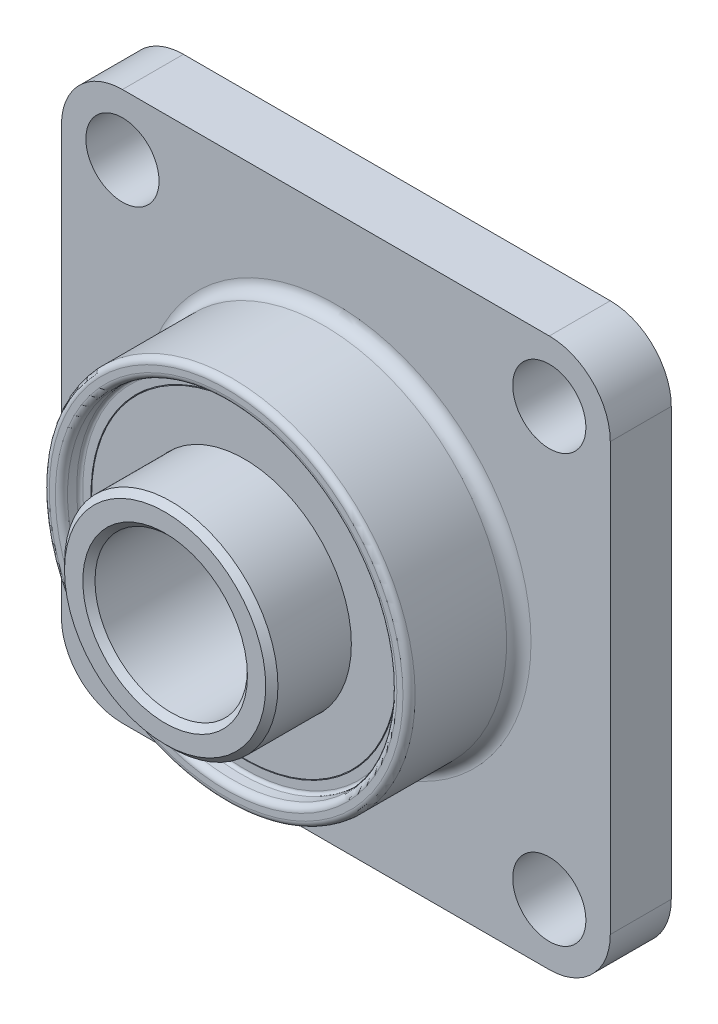
ISO-10303-21;
HEADER;
FILE_DESCRIPTION(('STEP AP214'),'2;1');
FILE_NAME('part.step','',(''),(''),'','','');
FILE_SCHEMA(('AUTOMOTIVE_DESIGN { 1 0 10303 214 1 1 1 1 }'));
ENDSEC;
DATA;
#1=APPLICATION_CONTEXT('core data for automotive mechanical design processes');
#2=APPLICATION_PROTOCOL_DEFINITION('international standard','automotive_design',2000,#1);
#3=PRODUCT_CONTEXT('',#1,'mechanical');
#4=PRODUCT('Part','Part','',(#3));
#5=PRODUCT_RELATED_PRODUCT_CATEGORY('part','',(#4));
#6=PRODUCT_DEFINITION_FORMATION('','',#4);
#7=PRODUCT_DEFINITION_CONTEXT('part definition',#1,'design');
#8=PRODUCT_DEFINITION('design','',#6,#7);
#9=PRODUCT_DEFINITION_SHAPE('','',#8);
#10=(LENGTH_UNIT() NAMED_UNIT(*) SI_UNIT(.MILLI.,.METRE.));
#11=(NAMED_UNIT(*) PLANE_ANGLE_UNIT() SI_UNIT($,.RADIAN.));
#12=(NAMED_UNIT(*) SI_UNIT($,.STERADIAN.) SOLID_ANGLE_UNIT());
#13=UNCERTAINTY_MEASURE_WITH_UNIT(LENGTH_MEASURE(1.E-05),#10,'distance_accuracy_value','');
#14=(GEOMETRIC_REPRESENTATION_CONTEXT(3) GLOBAL_UNCERTAINTY_ASSIGNED_CONTEXT((#13)) GLOBAL_UNIT_ASSIGNED_CONTEXT((#10,
#11,#12)) REPRESENTATION_CONTEXT('',''));
#15=CARTESIAN_POINT('',(0.,0.,0.));
#16=DIRECTION('',(0.,0.,1.));
#17=DIRECTION('',(1.,0.,0.));
#18=AXIS2_PLACEMENT_3D('',#15,#16,#17);
#19=CARTESIAN_POINT('',(0.,0.,38.));
#20=DIRECTION('',(0.,0.,1.));
#21=DIRECTION('',(1.,0.,0.));
#22=AXIS2_PLACEMENT_3D('',#19,#20,#21);
#23=PLANE('',#22);
#24=CARTESIAN_POINT('',(0.,0.,38.));
#25=DIRECTION('',(0.,0.,1.));
#26=DIRECTION('',(1.,0.,0.));
#27=AXIS2_PLACEMENT_3D('',#24,#25,#26);
#28=CIRCLE('',#27,13.5);
#29=CARTESIAN_POINT('',(13.5,0.,38.));
#30=VERTEX_POINT('',#29);
#31=EDGE_CURVE('E66',#30,#30,#28,.F.);
#32=ORIENTED_EDGE('',*,*,#31,.T.);
#33=EDGE_LOOP('',(#32));
#34=FACE_BOUND('',#33,.T.);
#35=CARTESIAN_POINT('',(0.,0.,38.));
#36=DIRECTION('',(0.,0.,1.));
#37=DIRECTION('',(1.,0.,0.));
#38=AXIS2_PLACEMENT_3D('',#35,#36,#37);
#39=CIRCLE('',#38,16.5);
#40=CARTESIAN_POINT('',(16.5,0.,38.));
#41=VERTEX_POINT('',#40);
#42=EDGE_CURVE('E69',#41,#41,#39,.T.);
#43=ORIENTED_EDGE('',*,*,#42,.T.);
#44=EDGE_LOOP('',(#43));
#45=FACE_BOUND('',#44,.T.);
#46=ADVANCED_FACE('F43',(#34,#45),#23,.T.);
#47=CARTESIAN_POINT('',(0.,0.,38.));
#48=DIRECTION('',(0.,0.,-1.));
#49=DIRECTION('',(-1.,0.,0.));
#50=AXIS2_PLACEMENT_3D('',#47,#48,#49);
#51=CYLINDRICAL_SURFACE('',#50,17.5);
#52=CARTESIAN_POINT('',(0.,0.,1.00000000000001));
#53=DIRECTION('',(0.,0.,-1.));
#54=DIRECTION('',(-1.,0.,0.));
#55=AXIS2_PLACEMENT_3D('',#52,#53,#54);
#56=CIRCLE('',#55,17.5);
#57=CARTESIAN_POINT('',(-17.5,0.,1.00000000000001));
#58=VERTEX_POINT('',#57);
#59=EDGE_CURVE('E11',#58,#58,#56,.F.);
#60=ORIENTED_EDGE('',*,*,#59,.T.);
#61=EDGE_LOOP('',(#60));
#62=FACE_BOUND('',#61,.T.);
#63=CARTESIAN_POINT('',(0.,0.,37.));
#64=DIRECTION('',(0.,0.,1.));
#65=DIRECTION('',(1.,0.,0.));
#66=AXIS2_PLACEMENT_3D('',#63,#64,#65);
#67=CIRCLE('',#66,17.5);
#68=CARTESIAN_POINT('',(17.5,0.,37.));
#69=VERTEX_POINT('',#68);
#70=EDGE_CURVE('E63',#69,#69,#67,.F.);
#71=ORIENTED_EDGE('',*,*,#70,.T.);
#72=EDGE_LOOP('',(#71));
#73=FACE_BOUND('',#72,.T.);
#74=ADVANCED_FACE('F95',(#62,#73),#51,.T.);
#75=CARTESIAN_POINT('',(0.,0.,38.));
#76=DIRECTION('',(0.,0.,-1.));
#77=DIRECTION('',(-1.,0.,0.));
#78=AXIS2_PLACEMENT_3D('',#75,#76,#77);
#79=CYLINDRICAL_SURFACE('',#78,12.5);
#80=CARTESIAN_POINT('',(0.,0.,1.00000000000001));
#81=DIRECTION('',(0.,0.,-1.));
#82=DIRECTION('',(-1.,0.,0.));
#83=AXIS2_PLACEMENT_3D('',#80,#81,#82);
#84=CIRCLE('',#83,12.5);
#85=CARTESIAN_POINT('',(-12.5,0.,1.00000000000001));
#86=VERTEX_POINT('',#85);
#87=EDGE_CURVE('E58',#86,#86,#84,.T.);
#88=ORIENTED_EDGE('',*,*,#87,.T.);
#89=EDGE_LOOP('',(#88));
#90=FACE_BOUND('',#89,.T.);
#91=CARTESIAN_POINT('',(0.,0.,37.));
#92=DIRECTION('',(0.,0.,1.));
#93=DIRECTION('',(1.,0.,0.));
#94=AXIS2_PLACEMENT_3D('',#91,#92,#93);
#95=CIRCLE('',#94,12.5);
#96=CARTESIAN_POINT('',(12.5,0.,37.));
#97=VERTEX_POINT('',#96);
#98=EDGE_CURVE('E72',#97,#97,#95,.T.);
#99=ORIENTED_EDGE('',*,*,#98,.T.);
#100=EDGE_LOOP('',(#99));
#101=FACE_BOUND('',#100,.T.);
#102=ADVANCED_FACE('F76',(#90,#101),#79,.F.);
#103=CARTESIAN_POINT('',(0.,0.,0.));
#104=DIRECTION('',(0.,0.,-1.));
#105=DIRECTION('',(-1.,0.,0.));
#106=AXIS2_PLACEMENT_3D('',#103,#104,#105);
#107=PLANE('',#106);
#108=CARTESIAN_POINT('',(0.,0.,0.));
#109=DIRECTION('',(0.,0.,-1.));
#110=DIRECTION('',(-1.,0.,0.));
#111=AXIS2_PLACEMENT_3D('',#108,#109,#110);
#112=CIRCLE('',#111,13.5);
#113=CARTESIAN_POINT('',(-13.5,0.,0.));
#114=VERTEX_POINT('',#113);
#115=EDGE_CURVE('E50',#114,#114,#112,.F.);
#116=ORIENTED_EDGE('',*,*,#115,.T.);
#117=EDGE_LOOP('',(#116));
#118=FACE_BOUND('',#117,.T.);
#119=CARTESIAN_POINT('',(0.,0.,0.));
#120=DIRECTION('',(0.,0.,-1.));
#121=DIRECTION('',(-1.,0.,0.));
#122=AXIS2_PLACEMENT_3D('',#119,#120,#121);
#123=CIRCLE('',#122,16.5);
#124=CARTESIAN_POINT('',(-16.5,0.,0.));
#125=VERTEX_POINT('',#124);
#126=EDGE_CURVE('E54',#125,#125,#123,.T.);
#127=ORIENTED_EDGE('',*,*,#126,.T.);
#128=EDGE_LOOP('',(#127));
#129=FACE_BOUND('',#128,.T.);
#130=ADVANCED_FACE('F81',(#118,#129),#107,.T.);
#131=CARTESIAN_POINT('',(0.,0.,37.));
#132=DIRECTION('',(0.,0.,1.));
#133=DIRECTION('',(1.,0.,0.));
#134=AXIS2_PLACEMENT_3D('',#131,#132,#133);
#135=CONICAL_SURFACE('',#134,12.5,0.785398163397453);
#136=ORIENTED_EDGE('',*,*,#31,.F.);
#137=EDGE_LOOP('',(#136));
#138=FACE_BOUND('',#137,.T.);
#139=ORIENTED_EDGE('',*,*,#98,.F.);
#140=EDGE_LOOP('',(#139));
#141=FACE_BOUND('',#140,.T.);
#142=ADVANCED_FACE('F78',(#138,#141),#135,.F.);
#143=CARTESIAN_POINT('',(0.,0.,38.));
#144=DIRECTION('',(0.,0.,-1.));
#145=DIRECTION('',(-1.,0.,0.));
#146=AXIS2_PLACEMENT_3D('',#143,#144,#145);
#147=CONICAL_SURFACE('',#146,16.5,0.785398163397447);
#148=ORIENTED_EDGE('',*,*,#70,.F.);
#149=EDGE_LOOP('',(#148));
#150=FACE_BOUND('',#149,.T.);
#151=ORIENTED_EDGE('',*,*,#42,.F.);
#152=EDGE_LOOP('',(#151));
#153=FACE_BOUND('',#152,.T.);
#154=ADVANCED_FACE('F80',(#150,#153),#147,.T.);
#155=CARTESIAN_POINT('',(0.,0.,1.00000000000001));
#156=DIRECTION('',(0.,0.,-1.));
#157=DIRECTION('',(-1.,0.,0.));
#158=AXIS2_PLACEMENT_3D('',#155,#156,#157);
#159=CONICAL_SURFACE('',#158,12.5,0.785398163397447);
#160=ORIENTED_EDGE('',*,*,#115,.F.);
#161=EDGE_LOOP('',(#160));
#162=FACE_BOUND('',#161,.T.);
#163=ORIENTED_EDGE('',*,*,#87,.F.);
#164=EDGE_LOOP('',(#163));
#165=FACE_BOUND('',#164,.T.);
#166=ADVANCED_FACE('F88',(#162,#165),#159,.F.);
#167=CARTESIAN_POINT('',(0.,0.,0.));
#168=DIRECTION('',(0.,0.,1.));
#169=DIRECTION('',(1.,0.,0.));
#170=AXIS2_PLACEMENT_3D('',#167,#168,#169);
#171=CONICAL_SURFACE('',#170,16.5,0.785398163397443);
#172=ORIENTED_EDGE('',*,*,#59,.F.);
#173=EDGE_LOOP('',(#172));
#174=FACE_BOUND('',#173,.T.);
#175=ORIENTED_EDGE('',*,*,#126,.F.);
#176=EDGE_LOOP('',(#175));
#177=FACE_BOUND('',#176,.T.);
#178=ADVANCED_FACE('F45',(#174,#177),#171,.T.);
#179=CLOSED_SHELL('',(#46,#74,#102,#130,#142,#154,#166,#178));
#180=MANIFOLD_SOLID_BREP('B2',#179);
#181=CARTESIAN_POINT('',(0.,0.,10.));
#182=DIRECTION('',(0.,0.,-1.));
#183=DIRECTION('',(-1.,0.,0.));
#184=AXIS2_PLACEMENT_3D('',#181,#182,#183);
#185=CYLINDRICAL_SURFACE('',#184,24.);
#186=CARTESIAN_POINT('',(0.,0.,10.));
#187=DIRECTION('',(0.,0.,1.));
#188=DIRECTION('',(1.,0.,0.));
#189=AXIS2_PLACEMENT_3D('',#186,#187,#188);
#190=CIRCLE('',#189,24.);
#191=CARTESIAN_POINT('',(24.,0.,10.));
#192=VERTEX_POINT('',#191);
#193=EDGE_CURVE('E581',#192,#192,#190,.T.);
#194=ORIENTED_EDGE('',*,*,#193,.T.);
#195=EDGE_LOOP('',(#194));
#196=FACE_BOUND('',#195,.T.);
#197=CARTESIAN_POINT('',(0.,0.,6.));
#198=DIRECTION('',(0.,0.,-1.));
#199=DIRECTION('',(-1.,0.,0.));
#200=AXIS2_PLACEMENT_3D('',#197,#198,#199);
#201=CIRCLE('',#200,24.);
#202=CARTESIAN_POINT('',(-24.,0.,6.));
#203=VERTEX_POINT('',#202);
#204=EDGE_CURVE('E176',#203,#203,#201,.T.);
#205=ORIENTED_EDGE('',*,*,#204,.T.);
#206=EDGE_LOOP('',(#205));
#207=FACE_BOUND('',#206,.T.);
#208=ADVANCED_FACE('F172',(#196,#207),#185,.F.);
#209=CARTESIAN_POINT('',(35.,35.,10.));
#210=DIRECTION('',(0.,0.,-1.));
#211=DIRECTION('',(-1.,0.,0.));
#212=AXIS2_PLACEMENT_3D('',#209,#210,#211);
#213=PLANE('',#212);
#214=CARTESIAN_POINT('',(0.,0.,10.));
#215=DIRECTION('',(0.,0.,1.));
#216=DIRECTION('',(1.,0.,0.));
#217=AXIS2_PLACEMENT_3D('',#214,#215,#216);
#218=CIRCLE('',#217,25.1543231034533);
#219=CARTESIAN_POINT('',(25.1543231034533,0.,10.));
#220=VERTEX_POINT('',#219);
#221=EDGE_CURVE('E583',#220,#220,#218,.T.);
#222=ORIENTED_EDGE('',*,*,#221,.T.);
#223=EDGE_LOOP('',(#222));
#224=FACE_BOUND('',#223,.T.);
#225=CARTESIAN_POINT('',(0.,0.,10.));
#226=DIRECTION('',(0.,0.,-1.));
#227=DIRECTION('',(-1.,0.,0.));
#228=AXIS2_PLACEMENT_3D('',#225,#226,#227);
#229=CIRCLE('',#228,25.0418054434066);
#230=CARTESIAN_POINT('',(-25.0418054434066,0.,10.));
#231=VERTEX_POINT('',#230);
#232=EDGE_CURVE('E333',#231,#231,#229,.F.);
#233=ORIENTED_EDGE('',*,*,#232,.F.);
#234=EDGE_LOOP('',(#233));
#235=FACE_BOUND('',#234,.T.);
#236=ADVANCED_FACE('F358',(#224,#235),#213,.F.);
#237=CARTESIAN_POINT('',(0.,0.,10.));
#238=DIRECTION('',(0.,0.,-1.));
#239=DIRECTION('',(-1.,0.,0.));
#240=AXIS2_PLACEMENT_3D('',#237,#238,#239);
#241=CIRCLE('',#240,32.);
#242=CARTESIAN_POINT('',(-32.,0.,10.));
#243=VERTEX_POINT('',#242);
#244=EDGE_CURVE('E318',#243,#243,#241,.T.);
#245=ORIENTED_EDGE('',*,*,#244,.T.);
#246=EDGE_LOOP('',(#245));
#247=FACE_BOUND('',#246,.T.);
#248=CARTESIAN_POINT('',(-35.,-35.,10.));
#249=DIRECTION('',(0.,0.,1.));
#250=DIRECTION('',(1.,0.,0.));
#251=AXIS2_PLACEMENT_3D('',#248,#249,#250);
#252=CIRCLE('',#251,6.);
#253=CARTESIAN_POINT('',(-29.,-35.,10.));
#254=VERTEX_POINT('',#253);
#255=EDGE_CURVE('E590',#254,#254,#252,.T.);
#256=ORIENTED_EDGE('',*,*,#255,.F.);
#257=EDGE_LOOP('',(#256));
#258=FACE_BOUND('',#257,.T.);
#259=CARTESIAN_POINT('',(35.,35.,10.));
#260=DIRECTION('',(0.,0.,1.));
#261=DIRECTION('',(1.,0.,0.));
#262=AXIS2_PLACEMENT_3D('',#259,#260,#261);
#263=CIRCLE('',#262,5.99999999999999);
#264=CARTESIAN_POINT('',(41.,35.,10.));
#265=VERTEX_POINT('',#264);
#266=EDGE_CURVE('E602',#265,#265,#263,.T.);
#267=ORIENTED_EDGE('',*,*,#266,.F.);
#268=EDGE_LOOP('',(#267));
#269=FACE_BOUND('',#268,.T.);
#270=CARTESIAN_POINT('',(35.,35.,10.));
#271=DIRECTION('',(0.,0.,1.));
#272=DIRECTION('',(-1.,0.,0.));
#273=AXIS2_PLACEMENT_3D('',#270,#271,#272);
#274=CIRCLE('',#273,10.);
#275=CARTESIAN_POINT('',(45.,34.9999999999999,10.));
#276=VERTEX_POINT('',#275);
#277=CARTESIAN_POINT('',(34.9999999999999,45.,10.));
#278=VERTEX_POINT('',#277);
#279=EDGE_CURVE('E300',#276,#278,#274,.T.);
#280=ORIENTED_EDGE('',*,*,#279,.T.);
#281=DIRECTION('',(-1.,0.,0.));
#282=VECTOR('',#281,1.);
#283=CARTESIAN_POINT('',(-34.9999999999999,45.,10.));
#284=LINE('',#283,#282);
#285=CARTESIAN_POINT('',(-34.9999999999999,45.,10.));
#286=VERTEX_POINT('',#285);
#287=EDGE_CURVE('E239',#278,#286,#284,.T.);
#288=ORIENTED_EDGE('',*,*,#287,.T.);
#289=CARTESIAN_POINT('',(-35.,35.,10.));
#290=DIRECTION('',(0.,0.,1.));
#291=DIRECTION('',(-1.,0.,0.));
#292=AXIS2_PLACEMENT_3D('',#289,#290,#291);
#293=CIRCLE('',#292,10.);
#294=CARTESIAN_POINT('',(-45.,34.9999999999999,10.));
#295=VERTEX_POINT('',#294);
#296=EDGE_CURVE('E614',#286,#295,#293,.T.);
#297=ORIENTED_EDGE('',*,*,#296,.T.);
#298=DIRECTION('',(0.,-1.,0.));
#299=VECTOR('',#298,1.);
#300=CARTESIAN_POINT('',(-45.,-34.9999999999999,10.));
#301=LINE('',#300,#299);
#302=CARTESIAN_POINT('',(-45.,-34.9999999999999,10.));
#303=VERTEX_POINT('',#302);
#304=EDGE_CURVE('E616',#295,#303,#301,.T.);
#305=ORIENTED_EDGE('',*,*,#304,.T.);
#306=CARTESIAN_POINT('',(-35.,-35.,10.));
#307=DIRECTION('',(0.,0.,1.));
#308=DIRECTION('',(-1.,0.,0.));
#309=AXIS2_PLACEMENT_3D('',#306,#307,#308);
#310=CIRCLE('',#309,10.);
#311=CARTESIAN_POINT('',(-34.9999999999999,-45.,10.));
#312=VERTEX_POINT('',#311);
#313=EDGE_CURVE('E263',#303,#312,#310,.T.);
#314=ORIENTED_EDGE('',*,*,#313,.T.);
#315=DIRECTION('',(1.,0.,0.));
#316=VECTOR('',#315,1.);
#317=CARTESIAN_POINT('',(-34.9999999999999,-45.,10.));
#318=LINE('',#317,#316);
#319=CARTESIAN_POINT('',(34.9999999999999,-45.,10.));
#320=VERTEX_POINT('',#319);
#321=EDGE_CURVE('E255',#312,#320,#318,.T.);
#322=ORIENTED_EDGE('',*,*,#321,.T.);
#323=CARTESIAN_POINT('',(35.,-35.,10.));
#324=DIRECTION('',(0.,0.,1.));
#325=DIRECTION('',(1.,0.,0.));
#326=AXIS2_PLACEMENT_3D('',#323,#324,#325);
#327=CIRCLE('',#326,10.);
#328=CARTESIAN_POINT('',(45.,-34.9999999999999,10.));
#329=VERTEX_POINT('',#328);
#330=EDGE_CURVE('E260',#320,#329,#327,.T.);
#331=ORIENTED_EDGE('',*,*,#330,.T.);
#332=DIRECTION('',(0.,1.,0.));
#333=VECTOR('',#332,1.);
#334=CARTESIAN_POINT('',(45.,-34.9999999999999,10.));
#335=LINE('',#334,#333);
#336=EDGE_CURVE('E197',#329,#276,#335,.T.);
#337=ORIENTED_EDGE('',*,*,#336,.T.);
#338=EDGE_LOOP('',(#280,#288,#297,#305,#314,#322,#331,#337));
#339=FACE_BOUND('',#338,.T.);
#340=CARTESIAN_POINT('',(-35.,35.,10.));
#341=DIRECTION('',(0.,0.,1.));
#342=DIRECTION('',(1.,0.,0.));
#343=AXIS2_PLACEMENT_3D('',#340,#341,#342);
#344=CIRCLE('',#343,6.);
#345=CARTESIAN_POINT('',(-29.,35.,10.));
#346=VERTEX_POINT('',#345);
#347=EDGE_CURVE('E288',#346,#346,#344,.T.);
#348=ORIENTED_EDGE('',*,*,#347,.F.);
#349=EDGE_LOOP('',(#348));
#350=FACE_BOUND('',#349,.T.);
#351=CARTESIAN_POINT('',(35.,-35.,10.));
#352=DIRECTION('',(0.,0.,1.));
#353=DIRECTION('',(1.,0.,0.));
#354=AXIS2_PLACEMENT_3D('',#351,#352,#353);
#355=CIRCLE('',#354,5.99999999999999);
#356=CARTESIAN_POINT('',(41.,-35.,10.));
#357=VERTEX_POINT('',#356);
#358=EDGE_CURVE('E596',#357,#357,#355,.T.);
#359=ORIENTED_EDGE('',*,*,#358,.F.);
#360=EDGE_LOOP('',(#359));
#361=FACE_BOUND('',#360,.T.);
#362=ADVANCED_FACE('F257',(#247,#258,#269,#339,#350,#361),#213,.F.);
#363=CARTESIAN_POINT('',(35.,35.,0.));
#364=DIRECTION('',(0.,0.,-1.));
#365=DIRECTION('',(-1.,0.,0.));
#366=AXIS2_PLACEMENT_3D('',#363,#364,#365);
#367=PLANE('',#366);
#368=CARTESIAN_POINT('',(-35.,35.,0.));
#369=DIRECTION('',(0.,0.,1.));
#370=DIRECTION('',(-1.,0.,0.));
#371=AXIS2_PLACEMENT_3D('',#368,#369,#370);
#372=CIRCLE('',#371,12.);
#373=CARTESIAN_POINT('',(-39.,23.6862915010152,0.));
#374=VERTEX_POINT('',#373);
#375=CARTESIAN_POINT('',(-23.6862915010152,39.,0.));
#376=VERTEX_POINT('',#375);
#377=EDGE_CURVE('E188',#374,#376,#372,.T.);
#378=ORIENTED_EDGE('',*,*,#377,.F.);
#379=DIRECTION('',(0.,1.,0.));
#380=VECTOR('',#379,1.);
#381=CARTESIAN_POINT('',(-39.,23.6862915010152,0.));
#382=LINE('',#381,#380);
#383=CARTESIAN_POINT('',(-39.,-23.6862915010152,0.));
#384=VERTEX_POINT('',#383);
#385=EDGE_CURVE('E511',#384,#374,#382,.T.);
#386=ORIENTED_EDGE('',*,*,#385,.F.);
#387=CARTESIAN_POINT('',(-35.,-35.,0.));
#388=DIRECTION('',(0.,0.,1.));
#389=DIRECTION('',(-1.,0.,0.));
#390=AXIS2_PLACEMENT_3D('',#387,#388,#389);
#391=CIRCLE('',#390,12.);
#392=CARTESIAN_POINT('',(-23.6862915010152,-39.,0.));
#393=VERTEX_POINT('',#392);
#394=EDGE_CURVE('E516',#393,#384,#391,.T.);
#395=ORIENTED_EDGE('',*,*,#394,.F.);
#396=DIRECTION('',(-1.,0.,0.));
#397=VECTOR('',#396,1.);
#398=CARTESIAN_POINT('',(-23.6862915010152,-39.,0.));
#399=LINE('',#398,#397);
#400=CARTESIAN_POINT('',(23.6862915010152,-39.,0.));
#401=VERTEX_POINT('',#400);
#402=EDGE_CURVE('E546',#401,#393,#399,.T.);
#403=ORIENTED_EDGE('',*,*,#402,.F.);
#404=CARTESIAN_POINT('',(35.,-35.,0.));
#405=DIRECTION('',(0.,0.,1.));
#406=DIRECTION('',(-1.,0.,0.));
#407=AXIS2_PLACEMENT_3D('',#404,#405,#406);
#408=CIRCLE('',#407,12.);
#409=CARTESIAN_POINT('',(39.,-23.6862915010152,0.));
#410=VERTEX_POINT('',#409);
#411=EDGE_CURVE('E543',#410,#401,#408,.T.);
#412=ORIENTED_EDGE('',*,*,#411,.F.);
#413=DIRECTION('',(0.,-1.,0.));
#414=VECTOR('',#413,1.);
#415=CARTESIAN_POINT('',(39.,-23.6862915010152,0.));
#416=LINE('',#415,#414);
#417=CARTESIAN_POINT('',(39.,23.6862915010152,0.));
#418=VERTEX_POINT('',#417);
#419=EDGE_CURVE('E540',#418,#410,#416,.T.);
#420=ORIENTED_EDGE('',*,*,#419,.F.);
#421=CARTESIAN_POINT('',(35.,35.,0.));
#422=DIRECTION('',(0.,0.,1.));
#423=DIRECTION('',(-1.,0.,0.));
#424=AXIS2_PLACEMENT_3D('',#421,#422,#423);
#425=CIRCLE('',#424,12.);
#426=CARTESIAN_POINT('',(23.6862915010152,39.,0.));
#427=VERTEX_POINT('',#426);
#428=EDGE_CURVE('E537',#427,#418,#425,.T.);
#429=ORIENTED_EDGE('',*,*,#428,.F.);
#430=DIRECTION('',(1.,0.,0.));
#431=VECTOR('',#430,1.);
#432=CARTESIAN_POINT('',(23.6862915010152,39.,0.));
#433=LINE('',#432,#431);
#434=EDGE_CURVE('E534',#376,#427,#433,.T.);
#435=ORIENTED_EDGE('',*,*,#434,.F.);
#436=EDGE_LOOP('',(#378,#386,#395,#403,#412,#420,#429,#435));
#437=FACE_BOUND('',#436,.T.);
#438=CARTESIAN_POINT('',(-35.,-35.,0.));
#439=DIRECTION('',(0.,0.,1.));
#440=DIRECTION('',(1.,0.,0.));
#441=AXIS2_PLACEMENT_3D('',#438,#439,#440);
#442=CIRCLE('',#441,6.);
#443=CARTESIAN_POINT('',(-29.,-35.,0.));
#444=VERTEX_POINT('',#443);
#445=EDGE_CURVE('E587',#444,#444,#442,.T.);
#446=ORIENTED_EDGE('',*,*,#445,.T.);
#447=EDGE_LOOP('',(#446));
#448=FACE_BOUND('',#447,.T.);
#449=CARTESIAN_POINT('',(35.,35.,0.));
#450=DIRECTION('',(0.,0.,1.));
#451=DIRECTION('',(1.,0.,0.));
#452=AXIS2_PLACEMENT_3D('',#449,#450,#451);
#453=CIRCLE('',#452,5.99999999999999);
#454=CARTESIAN_POINT('',(41.,35.,0.));
#455=VERTEX_POINT('',#454);
#456=EDGE_CURVE('E599',#455,#455,#453,.T.);
#457=ORIENTED_EDGE('',*,*,#456,.T.);
#458=EDGE_LOOP('',(#457));
#459=FACE_BOUND('',#458,.T.);
#460=CARTESIAN_POINT('',(35.,35.,0.));
#461=DIRECTION('',(0.,0.,1.));
#462=DIRECTION('',(-1.,0.,0.));
#463=AXIS2_PLACEMENT_3D('',#460,#461,#462);
#464=CIRCLE('',#463,10.);
#465=CARTESIAN_POINT('',(45.,34.9999999999999,0.));
#466=VERTEX_POINT('',#465);
#467=CARTESIAN_POINT('',(34.9999999999999,45.,0.));
#468=VERTEX_POINT('',#467);
#469=EDGE_CURVE('E284',#466,#468,#464,.T.);
#470=ORIENTED_EDGE('',*,*,#469,.F.);
#471=DIRECTION('',(0.,1.,0.));
#472=VECTOR('',#471,1.);
#473=CARTESIAN_POINT('',(45.,-34.9999999999999,0.));
#474=LINE('',#473,#472);
#475=CARTESIAN_POINT('',(45.,-34.9999999999999,0.));
#476=VERTEX_POINT('',#475);
#477=EDGE_CURVE('E230',#476,#466,#474,.T.);
#478=ORIENTED_EDGE('',*,*,#477,.F.);
#479=CARTESIAN_POINT('',(35.,-35.,0.));
#480=DIRECTION('',(0.,0.,1.));
#481=DIRECTION('',(1.,0.,0.));
#482=AXIS2_PLACEMENT_3D('',#479,#480,#481);
#483=CIRCLE('',#482,10.);
#484=CARTESIAN_POINT('',(34.9999999999999,-45.,0.));
#485=VERTEX_POINT('',#484);
#486=EDGE_CURVE('E297',#485,#476,#483,.T.);
#487=ORIENTED_EDGE('',*,*,#486,.F.);
#488=DIRECTION('',(1.,0.,0.));
#489=VECTOR('',#488,1.);
#490=CARTESIAN_POINT('',(-34.9999999999999,-45.,0.));
#491=LINE('',#490,#489);
#492=CARTESIAN_POINT('',(-34.9999999999999,-45.,0.));
#493=VERTEX_POINT('',#492);
#494=EDGE_CURVE('E272',#493,#485,#491,.T.);
#495=ORIENTED_EDGE('',*,*,#494,.F.);
#496=CARTESIAN_POINT('',(-35.,-35.,0.));
#497=DIRECTION('',(0.,0.,1.));
#498=DIRECTION('',(-1.,0.,0.));
#499=AXIS2_PLACEMENT_3D('',#496,#497,#498);
#500=CIRCLE('',#499,10.);
#501=CARTESIAN_POINT('',(-45.,-34.9999999999999,0.));
#502=VERTEX_POINT('',#501);
#503=EDGE_CURVE('E294',#502,#493,#500,.T.);
#504=ORIENTED_EDGE('',*,*,#503,.F.);
#505=DIRECTION('',(0.,-1.,0.));
#506=VECTOR('',#505,1.);
#507=CARTESIAN_POINT('',(-45.,-34.9999999999999,0.));
#508=LINE('',#507,#506);
#509=CARTESIAN_POINT('',(-45.,34.9999999999999,0.));
#510=VERTEX_POINT('',#509);
#511=EDGE_CURVE('E292',#510,#502,#508,.T.);
#512=ORIENTED_EDGE('',*,*,#511,.F.);
#513=CARTESIAN_POINT('',(-35.,35.,0.));
#514=DIRECTION('',(0.,0.,1.));
#515=DIRECTION('',(-1.,0.,0.));
#516=AXIS2_PLACEMENT_3D('',#513,#514,#515);
#517=CIRCLE('',#516,10.);
#518=CARTESIAN_POINT('',(-34.9999999999999,45.,0.));
#519=VERTEX_POINT('',#518);
#520=EDGE_CURVE('E290',#519,#510,#517,.T.);
#521=ORIENTED_EDGE('',*,*,#520,.F.);
#522=DIRECTION('',(-1.,0.,0.));
#523=VECTOR('',#522,1.);
#524=CARTESIAN_POINT('',(-34.9999999999999,45.,0.));
#525=LINE('',#524,#523);
#526=EDGE_CURVE('E287',#468,#519,#525,.T.);
#527=ORIENTED_EDGE('',*,*,#526,.F.);
#528=EDGE_LOOP('',(#470,#478,#487,#495,#504,#512,#521,#527));
#529=FACE_BOUND('',#528,.T.);
#530=CARTESIAN_POINT('',(-35.,35.,0.));
#531=DIRECTION('',(0.,0.,1.));
#532=DIRECTION('',(1.,0.,0.));
#533=AXIS2_PLACEMENT_3D('',#530,#531,#532);
#534=CIRCLE('',#533,6.);
#535=CARTESIAN_POINT('',(-29.,35.,0.));
#536=VERTEX_POINT('',#535);
#537=EDGE_CURVE('E605',#536,#536,#534,.T.);
#538=ORIENTED_EDGE('',*,*,#537,.T.);
#539=EDGE_LOOP('',(#538));
#540=FACE_BOUND('',#539,.T.);
#541=CARTESIAN_POINT('',(35.,-35.,0.));
#542=DIRECTION('',(0.,0.,1.));
#543=DIRECTION('',(1.,0.,0.));
#544=AXIS2_PLACEMENT_3D('',#541,#542,#543);
#545=CIRCLE('',#544,5.99999999999999);
#546=CARTESIAN_POINT('',(41.,-35.,0.));
#547=VERTEX_POINT('',#546);
#548=EDGE_CURVE('E593',#547,#547,#545,.T.);
#549=ORIENTED_EDGE('',*,*,#548,.T.);
#550=EDGE_LOOP('',(#549));
#551=FACE_BOUND('',#550,.T.);
#552=ADVANCED_FACE('F390',(#437,#448,#459,#529,#540,#551),#367,.T.);
#553=CARTESIAN_POINT('',(35.,35.,10.));
#554=DIRECTION('',(0.,0.,-1.));
#555=DIRECTION('',(-1.,0.,0.));
#556=AXIS2_PLACEMENT_3D('',#553,#554,#555);
#557=CYLINDRICAL_SURFACE('',#556,10.);
#558=ORIENTED_EDGE('',*,*,#469,.T.);
#559=DIRECTION('',(0.,0.,-1.));
#560=VECTOR('',#559,1.);
#561=CARTESIAN_POINT('',(34.9999999999999,45.,10.));
#562=LINE('',#561,#560);
#563=EDGE_CURVE('E313',#278,#468,#562,.T.);
#564=ORIENTED_EDGE('',*,*,#563,.F.);
#565=ORIENTED_EDGE('',*,*,#279,.F.);
#566=DIRECTION('',(0.,0.,-1.));
#567=VECTOR('',#566,1.);
#568=CARTESIAN_POINT('',(45.,34.9999999999999,10.));
#569=LINE('',#568,#567);
#570=EDGE_CURVE('E280',#276,#466,#569,.T.);
#571=ORIENTED_EDGE('',*,*,#570,.T.);
#572=EDGE_LOOP('',(#558,#564,#565,#571));
#573=FACE_BOUND('',#572,.T.);
#574=ADVANCED_FACE('F393',(#573),#557,.T.);
#575=CARTESIAN_POINT('',(-34.9999999999999,45.,10.));
#576=DIRECTION('',(0.,-1.,0.));
#577=DIRECTION('',(0.,0.,-1.));
#578=AXIS2_PLACEMENT_3D('',#575,#576,#577);
#579=PLANE('',#578);
#580=ORIENTED_EDGE('',*,*,#526,.T.);
#581=DIRECTION('',(0.,0.,-1.));
#582=VECTOR('',#581,1.);
#583=CARTESIAN_POINT('',(-34.9999999999999,45.,10.));
#584=LINE('',#583,#582);
#585=EDGE_CURVE('E310',#286,#519,#584,.T.);
#586=ORIENTED_EDGE('',*,*,#585,.F.);
#587=ORIENTED_EDGE('',*,*,#287,.F.);
#588=ORIENTED_EDGE('',*,*,#563,.T.);
#589=EDGE_LOOP('',(#580,#586,#587,#588));
#590=FACE_BOUND('',#589,.T.);
#591=ADVANCED_FACE('F412',(#590),#579,.F.);
#592=CARTESIAN_POINT('',(-35.,35.,10.));
#593=DIRECTION('',(0.,0.,-1.));
#594=DIRECTION('',(-1.,0.,0.));
#595=AXIS2_PLACEMENT_3D('',#592,#593,#594);
#596=CYLINDRICAL_SURFACE('',#595,10.);
#597=ORIENTED_EDGE('',*,*,#520,.T.);
#598=DIRECTION('',(0.,0.,-1.));
#599=VECTOR('',#598,1.);
#600=CARTESIAN_POINT('',(-45.,34.9999999999999,10.));
#601=LINE('',#600,#599);
#602=EDGE_CURVE('E307',#295,#510,#601,.T.);
#603=ORIENTED_EDGE('',*,*,#602,.F.);
#604=ORIENTED_EDGE('',*,*,#296,.F.);
#605=ORIENTED_EDGE('',*,*,#585,.T.);
#606=EDGE_LOOP('',(#597,#603,#604,#605));
#607=FACE_BOUND('',#606,.T.);
#608=ADVANCED_FACE('F408',(#607),#596,.T.);
#609=CARTESIAN_POINT('',(-45.,-34.9999999999999,10.));
#610=DIRECTION('',(1.,0.,0.));
#611=DIRECTION('',(0.,0.,-1.));
#612=AXIS2_PLACEMENT_3D('',#609,#610,#611);
#613=PLANE('',#612);
#614=ORIENTED_EDGE('',*,*,#511,.T.);
#615=DIRECTION('',(0.,0.,-1.));
#616=VECTOR('',#615,1.);
#617=CARTESIAN_POINT('',(-45.,-34.9999999999999,10.));
#618=LINE('',#617,#616);
#619=EDGE_CURVE('E304',#303,#502,#618,.T.);
#620=ORIENTED_EDGE('',*,*,#619,.F.);
#621=ORIENTED_EDGE('',*,*,#304,.F.);
#622=ORIENTED_EDGE('',*,*,#602,.T.);
#623=EDGE_LOOP('',(#614,#620,#621,#622));
#624=FACE_BOUND('',#623,.T.);
#625=ADVANCED_FACE('F404',(#624),#613,.F.);
#626=CARTESIAN_POINT('',(-35.,-35.,10.));
#627=DIRECTION('',(0.,0.,-1.));
#628=DIRECTION('',(-1.,0.,0.));
#629=AXIS2_PLACEMENT_3D('',#626,#627,#628);
#630=CYLINDRICAL_SURFACE('',#629,10.);
#631=ORIENTED_EDGE('',*,*,#503,.T.);
#632=DIRECTION('',(0.,0.,-1.));
#633=VECTOR('',#632,1.);
#634=CARTESIAN_POINT('',(-34.9999999999999,-45.,10.));
#635=LINE('',#634,#633);
#636=EDGE_CURVE('E275',#312,#493,#635,.T.);
#637=ORIENTED_EDGE('',*,*,#636,.F.);
#638=ORIENTED_EDGE('',*,*,#313,.F.);
#639=ORIENTED_EDGE('',*,*,#619,.T.);
#640=EDGE_LOOP('',(#631,#637,#638,#639));
#641=FACE_BOUND('',#640,.T.);
#642=ADVANCED_FACE('F401',(#641),#630,.T.);
#643=CARTESIAN_POINT('',(-34.9999999999999,-45.,10.));
#644=DIRECTION('',(0.,1.,0.));
#645=DIRECTION('',(0.,0.,1.));
#646=AXIS2_PLACEMENT_3D('',#643,#644,#645);
#647=PLANE('',#646);
#648=ORIENTED_EDGE('',*,*,#494,.T.);
#649=DIRECTION('',(0.,0.,-1.));
#650=VECTOR('',#649,1.);
#651=CARTESIAN_POINT('',(34.9999999999999,-45.,10.));
#652=LINE('',#651,#650);
#653=EDGE_CURVE('E269',#320,#485,#652,.T.);
#654=ORIENTED_EDGE('',*,*,#653,.F.);
#655=ORIENTED_EDGE('',*,*,#321,.F.);
#656=ORIENTED_EDGE('',*,*,#636,.T.);
#657=EDGE_LOOP('',(#648,#654,#655,#656));
#658=FACE_BOUND('',#657,.T.);
#659=ADVANCED_FACE('F270',(#658),#647,.F.);
#660=CARTESIAN_POINT('',(35.,-35.,10.));
#661=DIRECTION('',(0.,0.,-1.));
#662=DIRECTION('',(-1.,0.,0.));
#663=AXIS2_PLACEMENT_3D('',#660,#661,#662);
#664=CYLINDRICAL_SURFACE('',#663,10.);
#665=ORIENTED_EDGE('',*,*,#486,.T.);
#666=DIRECTION('',(0.,0.,-1.));
#667=VECTOR('',#666,1.);
#668=CARTESIAN_POINT('',(45.,-34.9999999999999,10.));
#669=LINE('',#668,#667);
#670=EDGE_CURVE('E276',#329,#476,#669,.T.);
#671=ORIENTED_EDGE('',*,*,#670,.F.);
#672=ORIENTED_EDGE('',*,*,#330,.F.);
#673=ORIENTED_EDGE('',*,*,#653,.T.);
#674=EDGE_LOOP('',(#665,#671,#672,#673));
#675=FACE_BOUND('',#674,.T.);
#676=ADVANCED_FACE('F278',(#675),#664,.T.);
#677=CARTESIAN_POINT('',(45.,-34.9999999999999,10.));
#678=DIRECTION('',(-1.,0.,0.));
#679=DIRECTION('',(0.,0.,1.));
#680=AXIS2_PLACEMENT_3D('',#677,#678,#679);
#681=PLANE('',#680);
#682=ORIENTED_EDGE('',*,*,#477,.T.);
#683=ORIENTED_EDGE('',*,*,#570,.F.);
#684=ORIENTED_EDGE('',*,*,#336,.F.);
#685=ORIENTED_EDGE('',*,*,#670,.T.);
#686=EDGE_LOOP('',(#682,#683,#684,#685));
#687=FACE_BOUND('',#686,.T.);
#688=ADVANCED_FACE('F387',(#687),#681,.F.);
#689=CARTESIAN_POINT('',(-35.,35.,10.));
#690=DIRECTION('',(0.,0.,-1.));
#691=DIRECTION('',(-1.,0.,0.));
#692=AXIS2_PLACEMENT_3D('',#689,#690,#691);
#693=CYLINDRICAL_SURFACE('',#692,6.);
#694=ORIENTED_EDGE('',*,*,#347,.T.);
#695=EDGE_LOOP('',(#694));
#696=FACE_BOUND('',#695,.T.);
#697=ORIENTED_EDGE('',*,*,#537,.F.);
#698=EDGE_LOOP('',(#697));
#699=FACE_BOUND('',#698,.T.);
#700=ADVANCED_FACE('F384',(#696,#699),#693,.F.);
#701=CARTESIAN_POINT('',(35.,35.,10.));
#702=DIRECTION('',(0.,0.,-1.));
#703=DIRECTION('',(-1.,0.,0.));
#704=AXIS2_PLACEMENT_3D('',#701,#702,#703);
#705=CYLINDRICAL_SURFACE('',#704,5.99999999999999);
#706=ORIENTED_EDGE('',*,*,#266,.T.);
#707=EDGE_LOOP('',(#706));
#708=FACE_BOUND('',#707,.T.);
#709=ORIENTED_EDGE('',*,*,#456,.F.);
#710=EDGE_LOOP('',(#709));
#711=FACE_BOUND('',#710,.T.);
#712=ADVANCED_FACE('F380',(#708,#711),#705,.F.);
#713=CARTESIAN_POINT('',(35.,-35.,10.));
#714=DIRECTION('',(0.,0.,-1.));
#715=DIRECTION('',(-1.,0.,0.));
#716=AXIS2_PLACEMENT_3D('',#713,#714,#715);
#717=CYLINDRICAL_SURFACE('',#716,5.99999999999999);
#718=ORIENTED_EDGE('',*,*,#358,.T.);
#719=EDGE_LOOP('',(#718));
#720=FACE_BOUND('',#719,.T.);
#721=ORIENTED_EDGE('',*,*,#548,.F.);
#722=EDGE_LOOP('',(#721));
#723=FACE_BOUND('',#722,.T.);
#724=ADVANCED_FACE('F376',(#720,#723),#717,.F.);
#725=CARTESIAN_POINT('',(-35.,-35.,10.));
#726=DIRECTION('',(0.,0.,-1.));
#727=DIRECTION('',(-1.,0.,0.));
#728=AXIS2_PLACEMENT_3D('',#725,#726,#727);
#729=CYLINDRICAL_SURFACE('',#728,6.);
#730=ORIENTED_EDGE('',*,*,#255,.T.);
#731=EDGE_LOOP('',(#730));
#732=FACE_BOUND('',#731,.T.);
#733=ORIENTED_EDGE('',*,*,#445,.F.);
#734=EDGE_LOOP('',(#733));
#735=FACE_BOUND('',#734,.T.);
#736=ADVANCED_FACE('F372',(#732,#735),#729,.F.);
#737=CARTESIAN_POINT('',(0.,0.,28.));
#738=DIRECTION('',(0.,0.,1.));
#739=DIRECTION('',(1.,0.,0.));
#740=AXIS2_PLACEMENT_3D('',#737,#738,#739);
#741=PLANE('',#740);
#742=CARTESIAN_POINT('',(0.,0.,28.));
#743=DIRECTION('',(0.,0.,1.));
#744=DIRECTION('',(1.,0.,0.));
#745=AXIS2_PLACEMENT_3D('',#742,#743,#744);
#746=CIRCLE('',#745,28.);
#747=CARTESIAN_POINT('',(28.,0.,28.));
#748=VERTEX_POINT('',#747);
#749=EDGE_CURVE('E327',#748,#748,#746,.F.);
#750=ORIENTED_EDGE('',*,*,#749,.T.);
#751=EDGE_LOOP('',(#750));
#752=FACE_BOUND('',#751,.T.);
#753=CARTESIAN_POINT('',(0.,0.,28.));
#754=DIRECTION('',(0.,0.,1.));
#755=DIRECTION('',(1.,0.,0.));
#756=AXIS2_PLACEMENT_3D('',#753,#754,#755);
#757=CIRCLE('',#756,29.);
#758=CARTESIAN_POINT('',(29.,0.,28.));
#759=VERTEX_POINT('',#758);
#760=EDGE_CURVE('E324',#759,#759,#757,.T.);
#761=ORIENTED_EDGE('',*,*,#760,.T.);
#762=EDGE_LOOP('',(#761));
#763=FACE_BOUND('',#762,.T.);
#764=ADVANCED_FACE('F375',(#752,#763),#741,.T.);
#765=CARTESIAN_POINT('',(0.,0.,28.));
#766=DIRECTION('',(0.,0.,-1.));
#767=DIRECTION('',(-1.,0.,0.));
#768=AXIS2_PLACEMENT_3D('',#765,#766,#767);
#769=CYLINDRICAL_SURFACE('',#768,30.);
#770=CARTESIAN_POINT('',(0.,0.,27.));
#771=DIRECTION('',(0.,0.,1.));
#772=DIRECTION('',(1.,0.,0.));
#773=AXIS2_PLACEMENT_3D('',#770,#771,#772);
#774=CIRCLE('',#773,30.);
#775=CARTESIAN_POINT('',(30.,0.,27.));
#776=VERTEX_POINT('',#775);
#777=EDGE_CURVE('E330',#776,#776,#774,.F.);
#778=ORIENTED_EDGE('',*,*,#777,.T.);
#779=EDGE_LOOP('',(#778));
#780=FACE_BOUND('',#779,.T.);
#781=CARTESIAN_POINT('',(0.,0.,12.));
#782=DIRECTION('',(0.,0.,-1.));
#783=DIRECTION('',(-1.,0.,0.));
#784=AXIS2_PLACEMENT_3D('',#781,#782,#783);
#785=CIRCLE('',#784,30.);
#786=CARTESIAN_POINT('',(-30.,0.,12.));
#787=VERTEX_POINT('',#786);
#788=EDGE_CURVE('E315',#787,#787,#785,.F.);
#789=ORIENTED_EDGE('',*,*,#788,.T.);
#790=EDGE_LOOP('',(#789));
#791=FACE_BOUND('',#790,.T.);
#792=ADVANCED_FACE('F370',(#780,#791),#769,.T.);
#793=CARTESIAN_POINT('',(0.,0.,28.));
#794=DIRECTION('',(0.,0.,-1.));
#795=DIRECTION('',(-1.,0.,0.));
#796=AXIS2_PLACEMENT_3D('',#793,#794,#795);
#797=CYLINDRICAL_SURFACE('',#796,27.);
#798=CARTESIAN_POINT('',(0.,0.,25.5));
#799=DIRECTION('',(0.,0.,1.));
#800=DIRECTION('',(1.,0.,0.));
#801=AXIS2_PLACEMENT_3D('',#798,#799,#800);
#802=CIRCLE('',#801,27.);
#803=CARTESIAN_POINT('',(27.,0.,25.5));
#804=VERTEX_POINT('',#803);
#805=EDGE_CURVE('E41',#804,#804,#802,.F.);
#806=ORIENTED_EDGE('',*,*,#805,.T.);
#807=EDGE_LOOP('',(#806));
#808=FACE_BOUND('',#807,.T.);
#809=CARTESIAN_POINT('',(0.,0.,27.));
#810=DIRECTION('',(0.,0.,1.));
#811=DIRECTION('',(1.,0.,0.));
#812=AXIS2_PLACEMENT_3D('',#809,#810,#811);
#813=CIRCLE('',#812,27.);
#814=CARTESIAN_POINT('',(27.,0.,27.));
#815=VERTEX_POINT('',#814);
#816=EDGE_CURVE('E321',#815,#815,#813,.T.);
#817=ORIENTED_EDGE('',*,*,#816,.T.);
#818=EDGE_LOOP('',(#817));
#819=FACE_BOUND('',#818,.T.);
#820=ADVANCED_FACE('F422',(#808,#819),#797,.F.);
#821=CARTESIAN_POINT('',(0.,0.,12.));
#822=DIRECTION('',(0.,0.,-1.));
#823=DIRECTION('',(-1.,0.,0.));
#824=AXIS2_PLACEMENT_3D('',#821,#822,#823);
#825=TOROIDAL_SURFACE('',#824,32.,2.);
#826=ORIENTED_EDGE('',*,*,#244,.F.);
#827=EDGE_LOOP('',(#826));
#828=FACE_BOUND('',#827,.T.);
#829=ORIENTED_EDGE('',*,*,#788,.F.);
#830=EDGE_LOOP('',(#829));
#831=FACE_BOUND('',#830,.T.);
#832=ADVANCED_FACE('F419',(#828,#831),#825,.F.);
#833=CARTESIAN_POINT('',(0.,0.,25.));
#834=DIRECTION('',(0.,0.,1.));
#835=DIRECTION('',(1.,0.,0.));
#836=AXIS2_PLACEMENT_3D('',#833,#834,#835);
#837=PLANE('',#836);
#838=CARTESIAN_POINT('',(0.,0.,25.));
#839=DIRECTION('',(0.,0.,1.));
#840=DIRECTION('',(1.,0.,0.));
#841=AXIS2_PLACEMENT_3D('',#838,#839,#840);
#842=CIRCLE('',#841,26.5);
#843=CARTESIAN_POINT('',(26.5,0.,25.));
#844=VERTEX_POINT('',#843);
#845=EDGE_CURVE('E181',#844,#844,#842,.T.);
#846=ORIENTED_EDGE('',*,*,#845,.T.);
#847=EDGE_LOOP('',(#846));
#848=FACE_BOUND('',#847,.T.);
#849=CARTESIAN_POINT('',(0.,0.,25.));
#850=DIRECTION('',(0.,0.,1.));
#851=DIRECTION('',(1.,0.,0.));
#852=AXIS2_PLACEMENT_3D('',#849,#850,#851);
#853=CIRCLE('',#852,25.1543231034533);
#854=CARTESIAN_POINT('',(25.1543231034533,0.,25.));
#855=VERTEX_POINT('',#854);
#856=EDGE_CURVE('E584',#855,#855,#853,.T.);
#857=ORIENTED_EDGE('',*,*,#856,.F.);
#858=EDGE_LOOP('',(#857));
#859=FACE_BOUND('',#858,.T.);
#860=ADVANCED_FACE('F339',(#848,#859),#837,.T.);
#861=CARTESIAN_POINT('',(0.,0.,25.));
#862=DIRECTION('',(0.,0.,-1.));
#863=DIRECTION('',(-1.,0.,0.));
#864=AXIS2_PLACEMENT_3D('',#861,#862,#863);
#865=CYLINDRICAL_SURFACE('',#864,25.1543231034533);
#866=ORIENTED_EDGE('',*,*,#856,.T.);
#867=EDGE_LOOP('',(#866));
#868=FACE_BOUND('',#867,.T.);
#869=ORIENTED_EDGE('',*,*,#221,.F.);
#870=EDGE_LOOP('',(#869));
#871=FACE_BOUND('',#870,.T.);
#872=ADVANCED_FACE('F427',(#868,#871),#865,.F.);
#873=CARTESIAN_POINT('',(0.,0.,27.));
#874=DIRECTION('',(0.,0.,1.));
#875=DIRECTION('',(1.,0.,0.));
#876=AXIS2_PLACEMENT_3D('',#873,#874,#875);
#877=TOROIDAL_SURFACE('',#876,28.,1.);
#878=ORIENTED_EDGE('',*,*,#749,.F.);
#879=EDGE_LOOP('',(#878));
#880=FACE_BOUND('',#879,.T.);
#881=ORIENTED_EDGE('',*,*,#816,.F.);
#882=EDGE_LOOP('',(#881));
#883=FACE_BOUND('',#882,.T.);
#884=ADVANCED_FACE('F424',(#880,#883),#877,.T.);
#885=CARTESIAN_POINT('',(0.,0.,27.));
#886=DIRECTION('',(0.,0.,1.));
#887=DIRECTION('',(1.,0.,0.));
#888=AXIS2_PLACEMENT_3D('',#885,#886,#887);
#889=TOROIDAL_SURFACE('',#888,29.,1.);
#890=ORIENTED_EDGE('',*,*,#777,.F.);
#891=EDGE_LOOP('',(#890));
#892=FACE_BOUND('',#891,.T.);
#893=ORIENTED_EDGE('',*,*,#760,.F.);
#894=EDGE_LOOP('',(#893));
#895=FACE_BOUND('',#894,.T.);
#896=ADVANCED_FACE('F426',(#892,#895),#889,.T.);
#897=CARTESIAN_POINT('',(0.,0.,25.));
#898=DIRECTION('',(0.,0.,1.));
#899=DIRECTION('',(1.,0.,0.));
#900=AXIS2_PLACEMENT_3D('',#897,#898,#899);
#901=PLANE('',#900);
#902=CARTESIAN_POINT('',(0.,0.,25.));
#903=DIRECTION('',(0.,0.,1.));
#904=DIRECTION('',(1.,0.,0.));
#905=AXIS2_PLACEMENT_3D('',#902,#903,#904);
#906=CIRCLE('',#905,25.0418054434066);
#907=CARTESIAN_POINT('',(25.0418054434066,0.,25.));
#908=VERTEX_POINT('',#907);
#909=EDGE_CURVE('E575',#908,#908,#906,.T.);
#910=ORIENTED_EDGE('',*,*,#909,.T.);
#911=EDGE_LOOP('',(#910));
#912=FACE_BOUND('',#911,.T.);
#913=CARTESIAN_POINT('',(0.,0.,25.));
#914=DIRECTION('',(0.,0.,1.));
#915=DIRECTION('',(1.,0.,0.));
#916=AXIS2_PLACEMENT_3D('',#913,#914,#915);
#917=CIRCLE('',#916,17.5418054434066);
#918=CARTESIAN_POINT('',(17.5418054434066,0.,25.));
#919=VERTEX_POINT('',#918);
#920=EDGE_CURVE('E572',#919,#919,#917,.T.);
#921=ORIENTED_EDGE('',*,*,#920,.F.);
#922=EDGE_LOOP('',(#921));
#923=FACE_BOUND('',#922,.T.);
#924=ADVANCED_FACE('F430',(#912,#923),#901,.T.);
#925=CARTESIAN_POINT('',(0.,0.,10.));
#926=DIRECTION('',(0.,0.,1.));
#927=DIRECTION('',(1.,0.,0.));
#928=AXIS2_PLACEMENT_3D('',#925,#926,#927);
#929=PLANE('',#928);
#930=ORIENTED_EDGE('',*,*,#193,.F.);
#931=EDGE_LOOP('',(#930));
#932=FACE_BOUND('',#931,.T.);
#933=CARTESIAN_POINT('',(0.,0.,10.));
#934=DIRECTION('',(0.,0.,1.));
#935=DIRECTION('',(1.,0.,0.));
#936=AXIS2_PLACEMENT_3D('',#933,#934,#935);
#937=CIRCLE('',#936,17.5418054434066);
#938=CARTESIAN_POINT('',(17.5418054434066,0.,10.));
#939=VERTEX_POINT('',#938);
#940=EDGE_CURVE('E576',#939,#939,#937,.T.);
#941=ORIENTED_EDGE('',*,*,#940,.T.);
#942=EDGE_LOOP('',(#941));
#943=FACE_BOUND('',#942,.T.);
#944=ADVANCED_FACE('F353',(#932,#943),#929,.F.);
#945=CARTESIAN_POINT('',(0.,0.,25.));
#946=DIRECTION('',(0.,0.,-1.));
#947=DIRECTION('',(-1.,0.,0.));
#948=AXIS2_PLACEMENT_3D('',#945,#946,#947);
#949=CYLINDRICAL_SURFACE('',#948,25.0418054434066);
#950=ORIENTED_EDGE('',*,*,#909,.F.);
#951=EDGE_LOOP('',(#950));
#952=FACE_BOUND('',#951,.T.);
#953=ORIENTED_EDGE('',*,*,#232,.T.);
#954=EDGE_LOOP('',(#953));
#955=FACE_BOUND('',#954,.T.);
#956=ADVANCED_FACE('F344',(#952,#955),#949,.T.);
#957=CARTESIAN_POINT('',(0.,0.,25.5));
#958=DIRECTION('',(0.,0.,1.));
#959=DIRECTION('',(1.,0.,0.));
#960=AXIS2_PLACEMENT_3D('',#957,#958,#959);
#961=TOROIDAL_SURFACE('',#960,26.5,0.5);
#962=ORIENTED_EDGE('',*,*,#805,.F.);
#963=EDGE_LOOP('',(#962));
#964=FACE_BOUND('',#963,.T.);
#965=ORIENTED_EDGE('',*,*,#845,.F.);
#966=EDGE_LOOP('',(#965));
#967=FACE_BOUND('',#966,.T.);
#968=ADVANCED_FACE('F174',(#964,#967),#961,.F.);
#969=CARTESIAN_POINT('',(0.,0.,25.));
#970=DIRECTION('',(0.,0.,-1.));
#971=DIRECTION('',(-1.,0.,0.));
#972=AXIS2_PLACEMENT_3D('',#969,#970,#971);
#973=CYLINDRICAL_SURFACE('',#972,17.5418054434066);
#974=ORIENTED_EDGE('',*,*,#920,.T.);
#975=EDGE_LOOP('',(#974));
#976=FACE_BOUND('',#975,.T.);
#977=ORIENTED_EDGE('',*,*,#940,.F.);
#978=EDGE_LOOP('',(#977));
#979=FACE_BOUND('',#978,.T.);
#980=ADVANCED_FACE('F343',(#976,#979),#973,.F.);
#981=CARTESIAN_POINT('',(-35.,35.,6.));
#982=DIRECTION('',(0.,0.,-1.));
#983=DIRECTION('',(-1.,0.,0.));
#984=AXIS2_PLACEMENT_3D('',#981,#982,#983);
#985=CYLINDRICAL_SURFACE('',#984,12.);
#986=ORIENTED_EDGE('',*,*,#377,.T.);
#987=DIRECTION('',(0.,0.,-1.));
#988=VECTOR('',#987,1.);
#989=CARTESIAN_POINT('',(-23.6862915010152,39.,6.));
#990=LINE('',#989,#988);
#991=CARTESIAN_POINT('',(-23.6862915010152,39.,6.));
#992=VERTEX_POINT('',#991);
#993=EDGE_CURVE('E532',#992,#376,#990,.T.);
#994=ORIENTED_EDGE('',*,*,#993,.F.);
#995=CARTESIAN_POINT('',(-35.,35.,6.));
#996=DIRECTION('',(0.,0.,1.));
#997=DIRECTION('',(-1.,0.,0.));
#998=AXIS2_PLACEMENT_3D('',#995,#996,#997);
#999=CIRCLE('',#998,12.);
#1000=CARTESIAN_POINT('',(-39.,23.6862915010152,6.));
#1001=VERTEX_POINT('',#1000);
#1002=EDGE_CURVE('E502',#1001,#992,#999,.T.);
#1003=ORIENTED_EDGE('',*,*,#1002,.F.);
#1004=DIRECTION('',(0.,0.,-1.));
#1005=VECTOR('',#1004,1.);
#1006=CARTESIAN_POINT('',(-39.,23.6862915010152,6.));
#1007=LINE('',#1006,#1005);
#1008=EDGE_CURVE('E551',#1001,#374,#1007,.T.);
#1009=ORIENTED_EDGE('',*,*,#1008,.T.);
#1010=EDGE_LOOP('',(#986,#994,#1003,#1009));
#1011=FACE_BOUND('',#1010,.T.);
#1012=ADVANCED_FACE('F350',(#1011),#985,.T.);
#1013=CARTESIAN_POINT('',(-39.,23.6862915010152,6.));
#1014=DIRECTION('',(-1.,0.,0.));
#1015=DIRECTION('',(0.,0.,1.));
#1016=AXIS2_PLACEMENT_3D('',#1013,#1014,#1015);
#1017=PLANE('',#1016);
#1018=ORIENTED_EDGE('',*,*,#385,.T.);
#1019=ORIENTED_EDGE('',*,*,#1008,.F.);
#1020=DIRECTION('',(0.,1.,0.));
#1021=VECTOR('',#1020,1.);
#1022=CARTESIAN_POINT('',(-39.,23.6862915010152,6.));
#1023=LINE('',#1022,#1021);
#1024=CARTESIAN_POINT('',(-39.,-23.6862915010152,6.));
#1025=VERTEX_POINT('',#1024);
#1026=EDGE_CURVE('E509',#1025,#1001,#1023,.T.);
#1027=ORIENTED_EDGE('',*,*,#1026,.F.);
#1028=DIRECTION('',(0.,0.,-1.));
#1029=VECTOR('',#1028,1.);
#1030=CARTESIAN_POINT('',(-39.,-23.6862915010152,6.));
#1031=LINE('',#1030,#1029);
#1032=EDGE_CURVE('E553',#1025,#384,#1031,.T.);
#1033=ORIENTED_EDGE('',*,*,#1032,.T.);
#1034=EDGE_LOOP('',(#1018,#1019,#1027,#1033));
#1035=FACE_BOUND('',#1034,.T.);
#1036=ADVANCED_FACE('F461',(#1035),#1017,.F.);
#1037=CARTESIAN_POINT('',(-35.,-35.,6.));
#1038=DIRECTION('',(0.,0.,-1.));
#1039=DIRECTION('',(-1.,0.,0.));
#1040=AXIS2_PLACEMENT_3D('',#1037,#1038,#1039);
#1041=CYLINDRICAL_SURFACE('',#1040,12.);
#1042=ORIENTED_EDGE('',*,*,#394,.T.);
#1043=ORIENTED_EDGE('',*,*,#1032,.F.);
#1044=CARTESIAN_POINT('',(-35.,-35.,6.));
#1045=DIRECTION('',(0.,0.,1.));
#1046=DIRECTION('',(-1.,0.,0.));
#1047=AXIS2_PLACEMENT_3D('',#1044,#1045,#1046);
#1048=CIRCLE('',#1047,12.);
#1049=CARTESIAN_POINT('',(-23.6862915010152,-39.,6.));
#1050=VERTEX_POINT('',#1049);
#1051=EDGE_CURVE('E529',#1050,#1025,#1048,.T.);
#1052=ORIENTED_EDGE('',*,*,#1051,.F.);
#1053=DIRECTION('',(0.,0.,-1.));
#1054=VECTOR('',#1053,1.);
#1055=CARTESIAN_POINT('',(-23.6862915010152,-39.,6.));
#1056=LINE('',#1055,#1054);
#1057=EDGE_CURVE('E556',#1050,#393,#1056,.T.);
#1058=ORIENTED_EDGE('',*,*,#1057,.T.);
#1059=EDGE_LOOP('',(#1042,#1043,#1052,#1058));
#1060=FACE_BOUND('',#1059,.T.);
#1061=ADVANCED_FACE('F482',(#1060),#1041,.T.);
#1062=CARTESIAN_POINT('',(-23.6862915010152,-39.,6.));
#1063=DIRECTION('',(0.,-1.,0.));
#1064=DIRECTION('',(0.,0.,-1.));
#1065=AXIS2_PLACEMENT_3D('',#1062,#1063,#1064);
#1066=PLANE('',#1065);
#1067=ORIENTED_EDGE('',*,*,#402,.T.);
#1068=ORIENTED_EDGE('',*,*,#1057,.F.);
#1069=DIRECTION('',(-1.,0.,0.));
#1070=VECTOR('',#1069,1.);
#1071=CARTESIAN_POINT('',(-23.6862915010152,-39.,6.));
#1072=LINE('',#1071,#1070);
#1073=CARTESIAN_POINT('',(23.6862915010152,-39.,6.));
#1074=VERTEX_POINT('',#1073);
#1075=EDGE_CURVE('E526',#1074,#1050,#1072,.T.);
#1076=ORIENTED_EDGE('',*,*,#1075,.F.);
#1077=DIRECTION('',(0.,0.,-1.));
#1078=VECTOR('',#1077,1.);
#1079=CARTESIAN_POINT('',(23.6862915010152,-39.,6.));
#1080=LINE('',#1079,#1078);
#1081=EDGE_CURVE('E559',#1074,#401,#1080,.T.);
#1082=ORIENTED_EDGE('',*,*,#1081,.T.);
#1083=EDGE_LOOP('',(#1067,#1068,#1076,#1082));
#1084=FACE_BOUND('',#1083,.T.);
#1085=ADVANCED_FACE('F478',(#1084),#1066,.F.);
#1086=CARTESIAN_POINT('',(35.,-35.,6.));
#1087=DIRECTION('',(0.,0.,-1.));
#1088=DIRECTION('',(-1.,0.,0.));
#1089=AXIS2_PLACEMENT_3D('',#1086,#1087,#1088);
#1090=CYLINDRICAL_SURFACE('',#1089,12.);
#1091=ORIENTED_EDGE('',*,*,#411,.T.);
#1092=ORIENTED_EDGE('',*,*,#1081,.F.);
#1093=CARTESIAN_POINT('',(35.,-35.,6.));
#1094=DIRECTION('',(0.,0.,1.));
#1095=DIRECTION('',(-1.,0.,0.));
#1096=AXIS2_PLACEMENT_3D('',#1093,#1094,#1095);
#1097=CIRCLE('',#1096,12.);
#1098=CARTESIAN_POINT('',(39.,-23.6862915010152,6.));
#1099=VERTEX_POINT('',#1098);
#1100=EDGE_CURVE('E523',#1099,#1074,#1097,.T.);
#1101=ORIENTED_EDGE('',*,*,#1100,.F.);
#1102=DIRECTION('',(0.,0.,-1.));
#1103=VECTOR('',#1102,1.);
#1104=CARTESIAN_POINT('',(39.,-23.6862915010152,6.));
#1105=LINE('',#1104,#1103);
#1106=EDGE_CURVE('E562',#1099,#410,#1105,.T.);
#1107=ORIENTED_EDGE('',*,*,#1106,.T.);
#1108=EDGE_LOOP('',(#1091,#1092,#1101,#1107));
#1109=FACE_BOUND('',#1108,.T.);
#1110=ADVANCED_FACE('F474',(#1109),#1090,.T.);
#1111=CARTESIAN_POINT('',(39.,-23.6862915010152,6.));
#1112=DIRECTION('',(1.,0.,0.));
#1113=DIRECTION('',(0.,0.,-1.));
#1114=AXIS2_PLACEMENT_3D('',#1111,#1112,#1113);
#1115=PLANE('',#1114);
#1116=ORIENTED_EDGE('',*,*,#419,.T.);
#1117=ORIENTED_EDGE('',*,*,#1106,.F.);
#1118=DIRECTION('',(0.,-1.,0.));
#1119=VECTOR('',#1118,1.);
#1120=CARTESIAN_POINT('',(39.,-23.6862915010152,6.));
#1121=LINE('',#1120,#1119);
#1122=CARTESIAN_POINT('',(39.,23.6862915010152,6.));
#1123=VERTEX_POINT('',#1122);
#1124=EDGE_CURVE('E520',#1123,#1099,#1121,.T.);
#1125=ORIENTED_EDGE('',*,*,#1124,.F.);
#1126=DIRECTION('',(0.,0.,-1.));
#1127=VECTOR('',#1126,1.);
#1128=CARTESIAN_POINT('',(39.,23.6862915010152,6.));
#1129=LINE('',#1128,#1127);
#1130=EDGE_CURVE('E565',#1123,#418,#1129,.T.);
#1131=ORIENTED_EDGE('',*,*,#1130,.T.);
#1132=EDGE_LOOP('',(#1116,#1117,#1125,#1131));
#1133=FACE_BOUND('',#1132,.T.);
#1134=ADVANCED_FACE('F470',(#1133),#1115,.F.);
#1135=CARTESIAN_POINT('',(35.,35.,6.));
#1136=DIRECTION('',(0.,0.,-1.));
#1137=DIRECTION('',(-1.,0.,0.));
#1138=AXIS2_PLACEMENT_3D('',#1135,#1136,#1137);
#1139=CYLINDRICAL_SURFACE('',#1138,12.);
#1140=ORIENTED_EDGE('',*,*,#428,.T.);
#1141=ORIENTED_EDGE('',*,*,#1130,.F.);
#1142=CARTESIAN_POINT('',(35.,35.,6.));
#1143=DIRECTION('',(0.,0.,1.));
#1144=DIRECTION('',(-1.,0.,0.));
#1145=AXIS2_PLACEMENT_3D('',#1142,#1143,#1144);
#1146=CIRCLE('',#1145,12.);
#1147=CARTESIAN_POINT('',(23.6862915010152,39.,6.));
#1148=VERTEX_POINT('',#1147);
#1149=EDGE_CURVE('E513',#1148,#1123,#1146,.T.);
#1150=ORIENTED_EDGE('',*,*,#1149,.F.);
#1151=DIRECTION('',(0.,0.,-1.));
#1152=VECTOR('',#1151,1.);
#1153=CARTESIAN_POINT('',(23.6862915010152,39.,6.));
#1154=LINE('',#1153,#1152);
#1155=EDGE_CURVE('E568',#1148,#427,#1154,.T.);
#1156=ORIENTED_EDGE('',*,*,#1155,.T.);
#1157=EDGE_LOOP('',(#1140,#1141,#1150,#1156));
#1158=FACE_BOUND('',#1157,.T.);
#1159=ADVANCED_FACE('F466',(#1158),#1139,.T.);
#1160=CARTESIAN_POINT('',(23.6862915010152,39.,6.));
#1161=DIRECTION('',(0.,1.,0.));
#1162=DIRECTION('',(0.,0.,1.));
#1163=AXIS2_PLACEMENT_3D('',#1160,#1161,#1162);
#1164=PLANE('',#1163);
#1165=ORIENTED_EDGE('',*,*,#434,.T.);
#1166=ORIENTED_EDGE('',*,*,#1155,.F.);
#1167=DIRECTION('',(1.,0.,0.));
#1168=VECTOR('',#1167,1.);
#1169=CARTESIAN_POINT('',(23.6862915010152,39.,6.));
#1170=LINE('',#1169,#1168);
#1171=EDGE_CURVE('E506',#992,#1148,#1170,.T.);
#1172=ORIENTED_EDGE('',*,*,#1171,.F.);
#1173=ORIENTED_EDGE('',*,*,#993,.T.);
#1174=EDGE_LOOP('',(#1165,#1166,#1172,#1173));
#1175=FACE_BOUND('',#1174,.T.);
#1176=ADVANCED_FACE('F462',(#1175),#1164,.F.);
#1177=CARTESIAN_POINT('',(-35.,35.,6.));
#1178=DIRECTION('',(0.,0.,-1.));
#1179=DIRECTION('',(-1.,0.,0.));
#1180=AXIS2_PLACEMENT_3D('',#1177,#1178,#1179);
#1181=PLANE('',#1180);
#1182=ORIENTED_EDGE('',*,*,#204,.F.);
#1183=EDGE_LOOP('',(#1182));
#1184=FACE_BOUND('',#1183,.T.);
#1185=ORIENTED_EDGE('',*,*,#1002,.T.);
#1186=ORIENTED_EDGE('',*,*,#1171,.T.);
#1187=ORIENTED_EDGE('',*,*,#1149,.T.);
#1188=ORIENTED_EDGE('',*,*,#1124,.T.);
#1189=ORIENTED_EDGE('',*,*,#1100,.T.);
#1190=ORIENTED_EDGE('',*,*,#1075,.T.);
#1191=ORIENTED_EDGE('',*,*,#1051,.T.);
#1192=ORIENTED_EDGE('',*,*,#1026,.T.);
#1193=EDGE_LOOP('',(#1185,#1186,#1187,#1188,#1189,#1190,#1191,#1192));
#1194=FACE_BOUND('',#1193,.T.);
#1195=ADVANCED_FACE('F465',(#1184,#1194),#1181,.T.);
#1196=CLOSED_SHELL('',(#208,#236,#362,#552,#574,#591,#608,#625,#642,#659,#676,#688,#700,#712,
#724,#736,#764,#792,#820,#832,#860,#872,#884,#896,#924,#944,#956,#968,#980,#1012,#1036,#1061,
#1085,#1110,#1134,#1159,#1176,#1195));
#1197=MANIFOLD_SOLID_BREP('B6',#1196);
#1198=ADVANCED_BREP_SHAPE_REPRESENTATION('',(#18,#180,#1197),#14);
#1199=SHAPE_DEFINITION_REPRESENTATION(#9,#1198);
ENDSEC;
END-ISO-10303-21;
